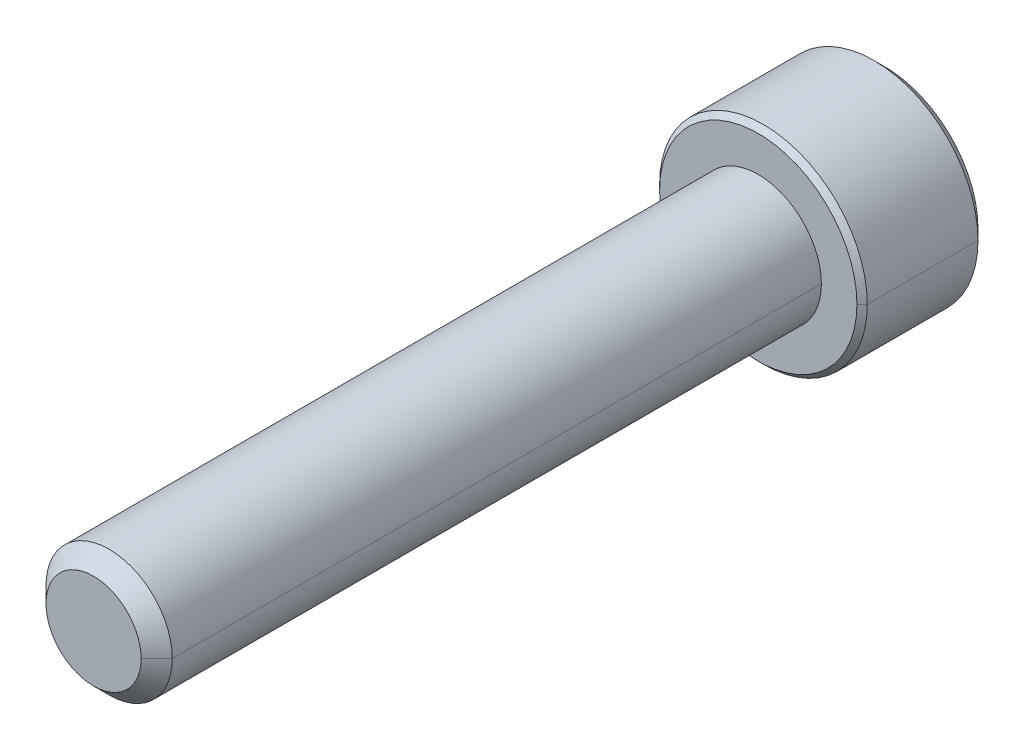
ISO-10303-21;
HEADER;
FILE_DESCRIPTION(('STEP AP214'),'2;1');
FILE_NAME('part.step','',(''),(''),'','','');
FILE_SCHEMA(('AUTOMOTIVE_DESIGN { 1 0 10303 214 1 1 1 1 }'));
ENDSEC;
DATA;
#1=APPLICATION_CONTEXT('core data for automotive mechanical design processes');
#2=APPLICATION_PROTOCOL_DEFINITION('international standard','automotive_design',2000,#1);
#3=PRODUCT_CONTEXT('',#1,'mechanical');
#4=PRODUCT('Part','Part','',(#3));
#5=PRODUCT_RELATED_PRODUCT_CATEGORY('part','',(#4));
#6=PRODUCT_DEFINITION_FORMATION('','',#4);
#7=PRODUCT_DEFINITION_CONTEXT('part definition',#1,'design');
#8=PRODUCT_DEFINITION('design','',#6,#7);
#9=PRODUCT_DEFINITION_SHAPE('','',#8);
#10=(LENGTH_UNIT() NAMED_UNIT(*) SI_UNIT(.MILLI.,.METRE.));
#11=(NAMED_UNIT(*) PLANE_ANGLE_UNIT() SI_UNIT($,.RADIAN.));
#12=(NAMED_UNIT(*) SI_UNIT($,.STERADIAN.) SOLID_ANGLE_UNIT());
#13=UNCERTAINTY_MEASURE_WITH_UNIT(LENGTH_MEASURE(1.E-05),#10,'distance_accuracy_value','');
#14=(GEOMETRIC_REPRESENTATION_CONTEXT(3) GLOBAL_UNCERTAINTY_ASSIGNED_CONTEXT((#13)) GLOBAL_UNIT_ASSIGNED_CONTEXT((#10,
#11,#12)) REPRESENTATION_CONTEXT('',''));
#15=CARTESIAN_POINT('',(0.,0.,0.));
#16=DIRECTION('',(0.,0.,1.));
#17=DIRECTION('',(1.,0.,0.));
#18=AXIS2_PLACEMENT_3D('',#15,#16,#17);
#19=CARTESIAN_POINT('',(0.,0.,-25.5984375));
#20=DIRECTION('',(0.,0.,-1.));
#21=DIRECTION('',(-1.,0.,0.));
#22=AXIS2_PLACEMENT_3D('',#19,#20,#21);
#23=CONICAL_SURFACE('',#22,3.96875,0.785398163397439);
#24=DIRECTION('',(0.707106781186541,0.,-0.707106781186554));
#25=VECTOR('',#24,1.);
#26=CARTESIAN_POINT('',(3.96875,0.,-25.5984375));
#27=LINE('',#26,#25);
#28=CARTESIAN_POINT('',(3.7703125,0.,-25.4));
#29=VERTEX_POINT('',#28);
#30=CARTESIAN_POINT('',(3.96875,0.,-25.5984375));
#31=VERTEX_POINT('',#30);
#32=EDGE_CURVE('E461',#29,#31,#27,.T.);
#33=ORIENTED_EDGE('',*,*,#32,.F.);
#34=CARTESIAN_POINT('',(0.,0.,-25.4));
#35=DIRECTION('',(0.,0.,1.));
#36=DIRECTION('',(-1.,0.,0.));
#37=AXIS2_PLACEMENT_3D('',#34,#35,#36);
#38=CIRCLE('',#37,3.7703125);
#39=CARTESIAN_POINT('',(-3.7703125,0.,-25.4));
#40=VERTEX_POINT('',#39);
#41=EDGE_CURVE('E379',#40,#29,#38,.T.);
#42=ORIENTED_EDGE('',*,*,#41,.F.);
#43=DIRECTION('',(-0.707106781186541,0.,-0.707106781186554));
#44=VECTOR('',#43,1.);
#45=CARTESIAN_POINT('',(-3.96875,0.,-25.5984375));
#46=LINE('',#45,#44);
#47=CARTESIAN_POINT('',(-3.96875,0.,-25.5984375));
#48=VERTEX_POINT('',#47);
#49=EDGE_CURVE('E395',#40,#48,#46,.T.);
#50=ORIENTED_EDGE('',*,*,#49,.T.);
#51=CARTESIAN_POINT('',(0.,0.,-25.5984375));
#52=DIRECTION('',(0.,0.,-1.));
#53=DIRECTION('',(-1.,0.,0.));
#54=AXIS2_PLACEMENT_3D('',#51,#52,#53);
#55=CIRCLE('',#54,3.96875);
#56=EDGE_CURVE('E427',#31,#48,#55,.T.);
#57=ORIENTED_EDGE('',*,*,#56,.F.);
#58=EDGE_LOOP('',(#33,#42,#50,#57));
#59=FACE_BOUND('',#58,.T.);
#60=ADVANCED_FACE('F16',(#59),#23,.T.);
#61=CARTESIAN_POINT('',(0.,0.,-30.226));
#62=DIRECTION('',(0.,0.,1.));
#63=DIRECTION('',(1.,0.,0.));
#64=AXIS2_PLACEMENT_3D('',#61,#62,#63);
#65=CONICAL_SURFACE('',#64,3.571875,0.785398163397443);
#66=DIRECTION('',(-0.707106781186545,0.,0.707106781186551));
#67=VECTOR('',#66,1.);
#68=CARTESIAN_POINT('',(-3.571875,0.,-30.226));
#69=LINE('',#68,#67);
#70=CARTESIAN_POINT('',(-3.571875,0.,-30.226));
#71=VERTEX_POINT('',#70);
#72=CARTESIAN_POINT('',(-3.96875,0.,-29.829125));
#73=VERTEX_POINT('',#72);
#74=EDGE_CURVE('E438',#71,#73,#69,.T.);
#75=ORIENTED_EDGE('',*,*,#74,.F.);
#76=CARTESIAN_POINT('',(0.,0.,-30.226));
#77=DIRECTION('',(0.,0.,-1.));
#78=DIRECTION('',(-1.,0.,0.));
#79=AXIS2_PLACEMENT_3D('',#76,#77,#78);
#80=CIRCLE('',#79,3.571875);
#81=CARTESIAN_POINT('',(3.571875,0.,-30.226));
#82=VERTEX_POINT('',#81);
#83=EDGE_CURVE('E425',#82,#71,#80,.T.);
#84=ORIENTED_EDGE('',*,*,#83,.F.);
#85=DIRECTION('',(0.707106781186545,0.,0.707106781186551));
#86=VECTOR('',#85,1.);
#87=CARTESIAN_POINT('',(3.571875,0.,-30.226));
#88=LINE('',#87,#86);
#89=CARTESIAN_POINT('',(3.96875,0.,-29.829125));
#90=VERTEX_POINT('',#89);
#91=EDGE_CURVE('E160',#82,#90,#88,.T.);
#92=ORIENTED_EDGE('',*,*,#91,.T.);
#93=CARTESIAN_POINT('',(0.,0.,-29.829125));
#94=DIRECTION('',(0.,0.,1.));
#95=DIRECTION('',(-1.,0.,0.));
#96=AXIS2_PLACEMENT_3D('',#93,#94,#95);
#97=CIRCLE('',#96,3.96875);
#98=EDGE_CURVE('E464',#73,#90,#97,.T.);
#99=ORIENTED_EDGE('',*,*,#98,.F.);
#100=EDGE_LOOP('',(#75,#84,#92,#99));
#101=FACE_BOUND('',#100,.T.);
#102=ADVANCED_FACE('F185',(#101),#65,.T.);
#103=CARTESIAN_POINT('',(-1.984375,1.14567944042316,-27.2494375));
#104=DIRECTION('',(-0.5,0.866025403784439,0.));
#105=DIRECTION('',(0.,0.,1.));
#106=AXIS2_PLACEMENT_3D('',#103,#104,#105);
#107=PLANE('',#106);
#108=DIRECTION('',(0.,0.,-1.));
#109=VECTOR('',#108,1.);
#110=CARTESIAN_POINT('',(-1.984375,1.14567944042316,-27.2494375));
#111=LINE('',#110,#109);
#112=CARTESIAN_POINT('',(-1.984375,1.14567944042316,-27.2494375));
#113=VERTEX_POINT('',#112);
#114=CARTESIAN_POINT('',(-1.984375,1.14567944042316,-30.226));
#115=VERTEX_POINT('',#114);
#116=EDGE_CURVE('E11',#113,#115,#111,.T.);
#117=ORIENTED_EDGE('',*,*,#116,.T.);
#118=CARTESIAN_POINT('',(-1.984375,1.14567944042316,-30.226));
#119=CARTESIAN_POINT('',(-1.73366939815845,1.29042438713373,-30.0812550532894));
#120=CARTESIAN_POINT('',(-1.50657958379882,1.42153475258449,-30.006003737124));
#121=CARTESIAN_POINT('',(-1.24618678362297,1.57187260586105,-29.9197167277815));
#122=CARTESIAN_POINT('',(-0.995841783844753,1.71640935887328,-29.9190206054613));
#123=CARTESIAN_POINT('',(-0.74595146867772,1.86068359960285,-29.9183257474609));
#124=CARTESIAN_POINT('',(-0.484436999445984,2.01166904881077,-30.0038176627032));
#125=CARTESIAN_POINT('',(-0.254810637070535,2.14424389094127,-30.0788850100942));
#126=CARTESIAN_POINT('',(0.,2.29135888084633,-30.226));
#127=B_SPLINE_CURVE_WITH_KNOTS('',2,(#118,#119,#120,#121,#122,#123,#124,#125,#126),
.UNSPECIFIED.,.F.,.F.,(3,2,2,2,3),(0.,0.25,0.5,0.75,1.),.UNSPECIFIED.);
#128=CARTESIAN_POINT('',(0.,2.29135888084632,-30.226));
#129=VERTEX_POINT('',#128);
#130=EDGE_CURVE('E156',#115,#129,#127,.T.);
#131=ORIENTED_EDGE('',*,*,#130,.T.);
#132=DIRECTION('',(0.,0.,-1.));
#133=VECTOR('',#132,1.);
#134=CARTESIAN_POINT('',(0.,2.29135888084632,-27.2494375));
#135=LINE('',#134,#133);
#136=CARTESIAN_POINT('',(0.,2.29135888084632,-27.2494375));
#137=VERTEX_POINT('',#136);
#138=EDGE_CURVE('E133',#137,#129,#135,.T.);
#139=ORIENTED_EDGE('',*,*,#138,.F.);
#140=DIRECTION('',(0.866025403784439,0.5,0.));
#141=VECTOR('',#140,1.);
#142=CARTESIAN_POINT('',(-1.984375,1.14567944042316,-27.2494375));
#143=LINE('',#142,#141);
#144=EDGE_CURVE('E148',#113,#137,#143,.T.);
#145=ORIENTED_EDGE('',*,*,#144,.F.);
#146=EDGE_LOOP('',(#117,#131,#139,#145));
#147=FACE_BOUND('',#146,.T.);
#148=ADVANCED_FACE('F175',(#147),#107,.F.);
#149=CARTESIAN_POINT('',(-1.984375,-1.14567944042316,-27.2494375));
#150=DIRECTION('',(-1.,0.,0.));
#151=DIRECTION('',(0.,0.,1.));
#152=AXIS2_PLACEMENT_3D('',#149,#150,#151);
#153=PLANE('',#152);
#154=DIRECTION('',(0.,0.,-1.));
#155=VECTOR('',#154,1.);
#156=CARTESIAN_POINT('',(-1.984375,-1.14567944042316,-27.2494375));
#157=LINE('',#156,#155);
#158=CARTESIAN_POINT('',(-1.984375,-1.14567944042316,-27.2494375));
#159=VERTEX_POINT('',#158);
#160=CARTESIAN_POINT('',(-1.984375,-1.14567944042316,-30.226));
#161=VERTEX_POINT('',#160);
#162=EDGE_CURVE('E30',#159,#161,#157,.T.);
#163=ORIENTED_EDGE('',*,*,#162,.T.);
#164=CARTESIAN_POINT('',(-1.984375,-1.14567944042316,-30.226));
#165=CARTESIAN_POINT('',(-1.984375,-0.853952770830586,-30.0801366652037));
#166=CARTESIAN_POINT('',(-1.984375,-0.589840907955465,-30.0048238254197));
#167=CARTESIAN_POINT('',(-1.984375,-0.288924978932779,-29.9190161191537));
#168=CARTESIAN_POINT('',(-1.984375,0.,-29.9190161191537));
#169=B_SPLINE_CURVE_WITH_KNOTS('',2,(#164,#165,#166,#167,#168),.UNSPECIFIED.,.F.,.F.,(3,2,3),
(0.,0.5,1.),.UNSPECIFIED.);
#170=CARTESIAN_POINT('',(-1.984375,0.,-29.9190161191537));
#171=VERTEX_POINT('',#170);
#172=EDGE_CURVE('E363',#161,#171,#169,.T.);
#173=ORIENTED_EDGE('',*,*,#172,.T.);
#174=CARTESIAN_POINT('',(-1.984375,0.,-29.9190161191537));
#175=CARTESIAN_POINT('',(-1.984375,0.288490660783442,-29.9190161191537));
#176=CARTESIAN_POINT('',(-1.984375,0.589967873643751,-30.0048600043339));
#177=CARTESIAN_POINT('',(-1.984375,0.853448743562751,-30.0798846515698));
#178=CARTESIAN_POINT('',(-1.984375,1.14567944042317,-30.226));
#179=B_SPLINE_CURVE_WITH_KNOTS('',2,(#174,#175,#176,#177,#178),.UNSPECIFIED.,.F.,.F.,(3,2,3),
(0.,0.5,1.),.UNSPECIFIED.);
#180=EDGE_CURVE('E245',#171,#115,#179,.T.);
#181=ORIENTED_EDGE('',*,*,#180,.T.);
#182=ORIENTED_EDGE('',*,*,#116,.F.);
#183=DIRECTION('',(0.,1.,0.));
#184=VECTOR('',#183,1.);
#185=CARTESIAN_POINT('',(-1.984375,-1.14567944042316,-27.2494375));
#186=LINE('',#185,#184);
#187=EDGE_CURVE('E166',#159,#113,#186,.T.);
#188=ORIENTED_EDGE('',*,*,#187,.F.);
#189=EDGE_LOOP('',(#163,#173,#181,#182,#188));
#190=FACE_BOUND('',#189,.T.);
#191=ADVANCED_FACE('F184',(#190),#153,.F.);
#192=CARTESIAN_POINT('',(0.,-2.29135888084632,-27.2494375));
#193=DIRECTION('',(-0.5,-0.866025403784439,0.));
#194=DIRECTION('',(-0.866025403784439,0.5,0.));
#195=AXIS2_PLACEMENT_3D('',#192,#193,#194);
#196=PLANE('',#195);
#197=DIRECTION('',(0.,0.,-1.));
#198=VECTOR('',#197,1.);
#199=CARTESIAN_POINT('',(0.,-2.29135888084632,-27.2494375));
#200=LINE('',#199,#198);
#201=CARTESIAN_POINT('',(0.,-2.29135888084632,-27.2494375));
#202=VERTEX_POINT('',#201);
#203=CARTESIAN_POINT('',(0.,-2.29135888084632,-30.226));
#204=VERTEX_POINT('',#203);
#205=EDGE_CURVE('E224',#202,#204,#200,.T.);
#206=ORIENTED_EDGE('',*,*,#205,.T.);
#207=CARTESIAN_POINT('',(0.,-2.29135888084632,-30.226));
#208=CARTESIAN_POINT('',(-0.250705601837906,-2.14661393413786,-30.0812550532915));
#209=CARTESIAN_POINT('',(-0.477795416201182,-2.015503568685,-30.006003737124));
#210=CARTESIAN_POINT('',(-0.738188216371028,-1.8651657154119,-29.9197167277824));
#211=CARTESIAN_POINT('',(-0.988533216155246,-1.72062896239621,-29.9190206054613));
#212=CARTESIAN_POINT('',(-1.23842353132543,-1.57635472166482,-29.9183257474599));
#213=CARTESIAN_POINT('',(-1.49993800055402,-1.42536927245872,-30.0038176627032));
#214=CARTESIAN_POINT('',(-1.7295643629364,-1.29279443032421,-30.0788850100982));
#215=CARTESIAN_POINT('',(-1.984375,-1.14567944042316,-30.226));
#216=B_SPLINE_CURVE_WITH_KNOTS('',2,(#207,#208,#209,#210,#211,#212,#213,#214,#215),
.UNSPECIFIED.,.F.,.F.,(3,2,2,2,3),(0.,0.25,0.5,0.75,1.),.UNSPECIFIED.);
#217=EDGE_CURVE('E250',#204,#161,#216,.T.);
#218=ORIENTED_EDGE('',*,*,#217,.T.);
#219=ORIENTED_EDGE('',*,*,#162,.F.);
#220=DIRECTION('',(-0.866025403784439,0.5,0.));
#221=VECTOR('',#220,1.);
#222=CARTESIAN_POINT('',(0.,-2.29135888084632,-27.2494375));
#223=LINE('',#222,#221);
#224=EDGE_CURVE('E162',#202,#159,#223,.T.);
#225=ORIENTED_EDGE('',*,*,#224,.F.);
#226=EDGE_LOOP('',(#206,#218,#219,#225));
#227=FACE_BOUND('',#226,.T.);
#228=ADVANCED_FACE('F256',(#227),#196,.F.);
#229=CARTESIAN_POINT('',(1.984375,-1.14567944042316,-27.2494375));
#230=DIRECTION('',(0.5,-0.866025403784439,0.));
#231=DIRECTION('',(0.,0.,-1.));
#232=AXIS2_PLACEMENT_3D('',#229,#230,#231);
#233=PLANE('',#232);
#234=DIRECTION('',(0.,0.,-1.));
#235=VECTOR('',#234,1.);
#236=CARTESIAN_POINT('',(1.984375,-1.14567944042316,-27.2494375));
#237=LINE('',#236,#235);
#238=CARTESIAN_POINT('',(1.984375,-1.14567944042316,-27.2494375));
#239=VERTEX_POINT('',#238);
#240=CARTESIAN_POINT('',(1.984375,-1.14567944042316,-30.226));
#241=VERTEX_POINT('',#240);
#242=EDGE_CURVE('E132',#239,#241,#237,.T.);
#243=ORIENTED_EDGE('',*,*,#242,.T.);
#244=CARTESIAN_POINT('',(1.984375,-1.14567944042316,-30.226));
#245=CARTESIAN_POINT('',(1.73366939816214,-1.2904243871316,-30.0812550532916));
#246=CARTESIAN_POINT('',(1.50657958379882,-1.42153475258449,-30.006003737124));
#247=CARTESIAN_POINT('',(1.24618678362332,-1.57187260586085,-29.9197167277806));
#248=CARTESIAN_POINT('',(0.995841783844752,-1.71640935887328,-29.9190206054613));
#249=CARTESIAN_POINT('',(0.745951468668843,-1.86068359960797,-29.9183257474618));
#250=CARTESIAN_POINT('',(0.484436999445984,-2.01166904881077,-30.0038176627032));
#251=CARTESIAN_POINT('',(0.254810637063568,-2.1442438909453,-30.0788850100983));
#252=CARTESIAN_POINT('',(0.,-2.29135888084633,-30.226));
#253=B_SPLINE_CURVE_WITH_KNOTS('',2,(#244,#245,#246,#247,#248,#249,#250,#251,#252),
.UNSPECIFIED.,.F.,.F.,(3,2,2,2,3),(0.,0.25,0.5,0.75,1.),.UNSPECIFIED.);
#254=EDGE_CURVE('E340',#241,#204,#253,.T.);
#255=ORIENTED_EDGE('',*,*,#254,.T.);
#256=ORIENTED_EDGE('',*,*,#205,.F.);
#257=DIRECTION('',(-0.866025403784439,-0.5,0.));
#258=VECTOR('',#257,1.);
#259=CARTESIAN_POINT('',(1.984375,-1.14567944042316,-27.2494375));
#260=LINE('',#259,#258);
#261=EDGE_CURVE('E143',#239,#202,#260,.T.);
#262=ORIENTED_EDGE('',*,*,#261,.F.);
#263=EDGE_LOOP('',(#243,#255,#256,#262));
#264=FACE_BOUND('',#263,.T.);
#265=ADVANCED_FACE('F266',(#264),#233,.F.);
#266=CARTESIAN_POINT('',(1.984375,1.14567944042316,-27.2494375));
#267=DIRECTION('',(1.,0.,0.));
#268=DIRECTION('',(0.,1.,0.));
#269=AXIS2_PLACEMENT_3D('',#266,#267,#268);
#270=PLANE('',#269);
#271=DIRECTION('',(0.,0.,-1.));
#272=VECTOR('',#271,1.);
#273=CARTESIAN_POINT('',(1.984375,1.14567944042316,-27.2494375));
#274=LINE('',#273,#272);
#275=CARTESIAN_POINT('',(1.984375,1.14567944042316,-27.2494375));
#276=VERTEX_POINT('',#275);
#277=CARTESIAN_POINT('',(1.984375,1.14567944042316,-30.226));
#278=VERTEX_POINT('',#277);
#279=EDGE_CURVE('E117',#276,#278,#274,.T.);
#280=ORIENTED_EDGE('',*,*,#279,.T.);
#281=CARTESIAN_POINT('',(1.984375,1.14567944042316,-30.226));
#282=CARTESIAN_POINT('',(1.984375,0.854053734702035,-30.0801871471394));
#283=CARTESIAN_POINT('',(1.984375,0.590027301204523,-30.0048769406947));
#284=CARTESIAN_POINT('',(1.984375,0.289359062323233,-29.9191151219193));
#285=CARTESIAN_POINT('',(1.984375,0.000124911500085914,-29.9190161230851));
#286=CARTESIAN_POINT('',(1.984375,-0.288056722159542,-29.9189174845056));
#287=CARTESIAN_POINT('',(1.984375,-0.589781630516821,-30.0048069367442));
#288=CARTESIAN_POINT('',(1.984375,-0.853347275069476,-30.0798339173232));
#289=CARTESIAN_POINT('',(1.984375,-1.14567944042316,-30.226));
#290=B_SPLINE_CURVE_WITH_KNOTS('',2,(#281,#282,#283,#284,#285,#286,#287,#288,#289),
.UNSPECIFIED.,.F.,.F.,(3,2,2,2,3),(0.,0.25,0.5,0.75,1.),.UNSPECIFIED.);
#291=EDGE_CURVE('E309',#278,#241,#290,.T.);
#292=ORIENTED_EDGE('',*,*,#291,.T.);
#293=ORIENTED_EDGE('',*,*,#242,.F.);
#294=DIRECTION('',(0.,-1.,0.));
#295=VECTOR('',#294,1.);
#296=CARTESIAN_POINT('',(1.984375,1.14567944042316,-27.2494375));
#297=LINE('',#296,#295);
#298=EDGE_CURVE('E136',#276,#239,#297,.T.);
#299=ORIENTED_EDGE('',*,*,#298,.F.);
#300=EDGE_LOOP('',(#280,#292,#293,#299));
#301=FACE_BOUND('',#300,.T.);
#302=ADVANCED_FACE('F137',(#301),#270,.F.);
#303=CARTESIAN_POINT('',(0.,2.29135888084632,-27.2494375));
#304=DIRECTION('',(0.5,0.866025403784439,0.));
#305=DIRECTION('',(0.,0.,-1.));
#306=AXIS2_PLACEMENT_3D('',#303,#304,#305);
#307=PLANE('',#306);
#308=ORIENTED_EDGE('',*,*,#138,.T.);
#309=CARTESIAN_POINT('',(0.,2.29135888084632,-30.226));
#310=CARTESIAN_POINT('',(0.250705601841665,2.14661393413569,-30.0812550532894));
#311=CARTESIAN_POINT('',(0.477795416201182,2.015503568685,-30.006003737124));
#312=CARTESIAN_POINT('',(0.738188216377096,1.8651657154084,-29.9197167277815));
#313=CARTESIAN_POINT('',(0.988533216155247,1.72062896239621,-29.9190206054614));
#314=CARTESIAN_POINT('',(1.23842353132225,1.57635472166666,-29.9183257474609));
#315=CARTESIAN_POINT('',(1.49993800055402,1.42536927245872,-30.0038176627032));
#316=CARTESIAN_POINT('',(1.7295643629294,1.29279443032825,-30.0788850100942));
#317=CARTESIAN_POINT('',(1.984375,1.14567944042316,-30.226));
#318=B_SPLINE_CURVE_WITH_KNOTS('',2,(#309,#310,#311,#312,#313,#314,#315,#316,#317),
.UNSPECIFIED.,.F.,.F.,(3,2,2,2,3),(0.,0.25,0.5,0.75,1.),.UNSPECIFIED.);
#319=EDGE_CURVE('E125',#129,#278,#318,.T.);
#320=ORIENTED_EDGE('',*,*,#319,.T.);
#321=ORIENTED_EDGE('',*,*,#279,.F.);
#322=DIRECTION('',(0.866025403784439,-0.5,0.));
#323=VECTOR('',#322,1.);
#324=CARTESIAN_POINT('',(0.,2.29135888084632,-27.2494375));
#325=LINE('',#324,#323);
#326=EDGE_CURVE('E121',#137,#276,#325,.T.);
#327=ORIENTED_EDGE('',*,*,#326,.F.);
#328=EDGE_LOOP('',(#308,#320,#321,#327));
#329=FACE_BOUND('',#328,.T.);
#330=ADVANCED_FACE('F119',(#329),#307,.F.);
#331=CARTESIAN_POINT('',(1.984375,3.43703832126949,-27.2494375));
#332=DIRECTION('',(0.,0.,-1.));
#333=DIRECTION('',(0.,-1.,0.));
#334=AXIS2_PLACEMENT_3D('',#331,#332,#333);
#335=PLANE('',#334);
#336=ORIENTED_EDGE('',*,*,#144,.T.);
#337=ORIENTED_EDGE('',*,*,#326,.T.);
#338=ORIENTED_EDGE('',*,*,#298,.T.);
#339=ORIENTED_EDGE('',*,*,#261,.T.);
#340=ORIENTED_EDGE('',*,*,#224,.T.);
#341=ORIENTED_EDGE('',*,*,#187,.T.);
#342=EDGE_LOOP('',(#336,#337,#338,#339,#340,#341));
#343=FACE_BOUND('',#342,.T.);
#344=ADVANCED_FACE('F145',(#343),#335,.T.);
#345=CARTESIAN_POINT('',(0.,0.,-30.226));
#346=DIRECTION('',(0.,0.,-1.));
#347=DIRECTION('',(-1.,0.,0.));
#348=AXIS2_PLACEMENT_3D('',#345,#346,#347);
#349=CONICAL_SURFACE('',#348,2.29135888084632,0.78539816339745);
#350=CARTESIAN_POINT('',(0.,0.,-30.226));
#351=DIRECTION('',(0.,0.,-1.));
#352=DIRECTION('',(-1.,0.,0.));
#353=AXIS2_PLACEMENT_3D('',#350,#351,#352);
#354=CIRCLE('',#353,2.29135888084632);
#355=EDGE_CURVE('E237',#115,#129,#354,.T.);
#356=ORIENTED_EDGE('',*,*,#355,.T.);
#357=ORIENTED_EDGE('',*,*,#130,.F.);
#358=EDGE_LOOP('',(#356,#357));
#359=FACE_BOUND('',#358,.T.);
#360=ADVANCED_FACE('F206',(#359),#349,.F.);
#361=CARTESIAN_POINT('',(0.,0.,-30.226));
#362=DIRECTION('',(0.,0.,-1.));
#363=DIRECTION('',(-1.,0.,0.));
#364=AXIS2_PLACEMENT_3D('',#361,#362,#363);
#365=CONICAL_SURFACE('',#364,2.29135888084632,0.78539816339745);
#366=DIRECTION('',(-0.707106781186549,0.,-0.707106781186546));
#367=VECTOR('',#366,1.);
#368=CARTESIAN_POINT('',(-2.29135888084632,0.,-30.226));
#369=LINE('',#368,#367);
#370=CARTESIAN_POINT('',(-2.29135888084632,0.,-30.226));
#371=VERTEX_POINT('',#370);
#372=EDGE_CURVE('E240',#171,#371,#369,.T.);
#373=ORIENTED_EDGE('',*,*,#372,.F.);
#374=ORIENTED_EDGE('',*,*,#172,.F.);
#375=CARTESIAN_POINT('',(0.,0.,-30.226));
#376=DIRECTION('',(0.,0.,-1.));
#377=DIRECTION('',(-1.,0.,0.));
#378=AXIS2_PLACEMENT_3D('',#375,#376,#377);
#379=CIRCLE('',#378,2.29135888084632);
#380=EDGE_CURVE('E232',#161,#371,#379,.T.);
#381=ORIENTED_EDGE('',*,*,#380,.T.);
#382=EDGE_LOOP('',(#373,#374,#381));
#383=FACE_BOUND('',#382,.T.);
#384=ADVANCED_FACE('F201',(#383),#365,.F.);
#385=CARTESIAN_POINT('',(0.,0.,-30.226));
#386=DIRECTION('',(0.,0.,-1.));
#387=DIRECTION('',(-1.,0.,0.));
#388=AXIS2_PLACEMENT_3D('',#385,#386,#387);
#389=CONICAL_SURFACE('',#388,2.29135888084632,0.78539816339745);
#390=CARTESIAN_POINT('',(0.,0.,-30.226));
#391=DIRECTION('',(0.,0.,-1.));
#392=DIRECTION('',(-1.,0.,0.));
#393=AXIS2_PLACEMENT_3D('',#390,#391,#392);
#394=CIRCLE('',#393,2.29135888084632);
#395=EDGE_CURVE('E227',#204,#161,#394,.T.);
#396=ORIENTED_EDGE('',*,*,#395,.T.);
#397=ORIENTED_EDGE('',*,*,#217,.F.);
#398=EDGE_LOOP('',(#396,#397));
#399=FACE_BOUND('',#398,.T.);
#400=ADVANCED_FACE('F205',(#399),#389,.F.);
#401=CARTESIAN_POINT('',(0.,0.,-30.226));
#402=DIRECTION('',(0.,0.,-1.));
#403=DIRECTION('',(-1.,0.,0.));
#404=AXIS2_PLACEMENT_3D('',#401,#402,#403);
#405=CONICAL_SURFACE('',#404,2.29135888084632,0.78539816339745);
#406=CARTESIAN_POINT('',(0.,0.,-30.226));
#407=DIRECTION('',(0.,0.,-1.));
#408=DIRECTION('',(-1.,0.,0.));
#409=AXIS2_PLACEMENT_3D('',#406,#407,#408);
#410=CIRCLE('',#409,2.29135888084632);
#411=EDGE_CURVE('E231',#241,#204,#410,.T.);
#412=ORIENTED_EDGE('',*,*,#411,.T.);
#413=ORIENTED_EDGE('',*,*,#254,.F.);
#414=EDGE_LOOP('',(#412,#413));
#415=FACE_BOUND('',#414,.T.);
#416=ADVANCED_FACE('F281',(#415),#405,.F.);
#417=CARTESIAN_POINT('',(0.,0.,-30.226));
#418=DIRECTION('',(0.,0.,-1.));
#419=DIRECTION('',(-1.,0.,0.));
#420=AXIS2_PLACEMENT_3D('',#417,#418,#419);
#421=CONICAL_SURFACE('',#420,2.29135888084632,0.78539816339745);
#422=CARTESIAN_POINT('',(0.,0.,-30.226));
#423=DIRECTION('',(0.,0.,-1.));
#424=DIRECTION('',(-1.,0.,0.));
#425=AXIS2_PLACEMENT_3D('',#422,#423,#424);
#426=CIRCLE('',#425,2.29135888084632);
#427=EDGE_CURVE('E302',#278,#241,#426,.T.);
#428=ORIENTED_EDGE('',*,*,#427,.T.);
#429=ORIENTED_EDGE('',*,*,#291,.F.);
#430=EDGE_LOOP('',(#428,#429));
#431=FACE_BOUND('',#430,.T.);
#432=ADVANCED_FACE('F18',(#431),#421,.F.);
#433=CARTESIAN_POINT('',(0.,0.,-30.226));
#434=DIRECTION('',(0.,0.,-1.));
#435=DIRECTION('',(-1.,0.,0.));
#436=AXIS2_PLACEMENT_3D('',#433,#434,#435);
#437=CONICAL_SURFACE('',#436,2.29135888084632,0.78539816339745);
#438=CARTESIAN_POINT('',(0.,0.,-30.226));
#439=DIRECTION('',(0.,0.,-1.));
#440=DIRECTION('',(-1.,0.,0.));
#441=AXIS2_PLACEMENT_3D('',#438,#439,#440);
#442=CIRCLE('',#441,2.29135888084632);
#443=EDGE_CURVE('E305',#129,#278,#442,.T.);
#444=ORIENTED_EDGE('',*,*,#443,.T.);
#445=ORIENTED_EDGE('',*,*,#319,.F.);
#446=EDGE_LOOP('',(#444,#445));
#447=FACE_BOUND('',#446,.T.);
#448=ADVANCED_FACE('F635',(#447),#437,.F.);
#449=CARTESIAN_POINT('',(0.,0.,-25.4));
#450=DIRECTION('',(0.,0.,-1.));
#451=DIRECTION('',(0.,-1.,0.));
#452=AXIS2_PLACEMENT_3D('',#449,#450,#451);
#453=PLANE('',#452);
#454=CARTESIAN_POINT('',(0.,0.,-25.4));
#455=DIRECTION('',(0.,0.,1.));
#456=DIRECTION('',(-1.,0.,0.));
#457=AXIS2_PLACEMENT_3D('',#454,#455,#456);
#458=CIRCLE('',#457,2.413);
#459=CARTESIAN_POINT('',(2.413,0.,-25.4));
#460=VERTEX_POINT('',#459);
#461=CARTESIAN_POINT('',(-2.413,0.,-25.4));
#462=VERTEX_POINT('',#461);
#463=EDGE_CURVE('E412',#460,#462,#458,.T.);
#464=ORIENTED_EDGE('',*,*,#463,.F.);
#465=CARTESIAN_POINT('',(0.,0.,-25.4));
#466=DIRECTION('',(0.,0.,1.));
#467=DIRECTION('',(-1.,0.,0.));
#468=AXIS2_PLACEMENT_3D('',#465,#466,#467);
#469=CIRCLE('',#468,2.413);
#470=EDGE_CURVE('E401',#462,#460,#469,.T.);
#471=ORIENTED_EDGE('',*,*,#470,.F.);
#472=EDGE_LOOP('',(#464,#471));
#473=FACE_BOUND('',#472,.T.);
#474=ORIENTED_EDGE('',*,*,#41,.T.);
#475=CARTESIAN_POINT('',(0.,0.,-25.4));
#476=DIRECTION('',(0.,0.,1.));
#477=DIRECTION('',(-1.,0.,0.));
#478=AXIS2_PLACEMENT_3D('',#475,#476,#477);
#479=CIRCLE('',#478,3.7703125);
#480=EDGE_CURVE('E1012',#29,#40,#479,.T.);
#481=ORIENTED_EDGE('',*,*,#480,.T.);
#482=EDGE_LOOP('',(#474,#481));
#483=FACE_BOUND('',#482,.T.);
#484=ADVANCED_FACE('F610',(#473,#483),#453,.F.);
#485=CARTESIAN_POINT('',(0.,0.,-30.226));
#486=DIRECTION('',(0.,0.,-1.));
#487=DIRECTION('',(0.,-1.,0.));
#488=AXIS2_PLACEMENT_3D('',#485,#486,#487);
#489=PLANE('',#488);
#490=ORIENTED_EDGE('',*,*,#355,.F.);
#491=CARTESIAN_POINT('',(0.,0.,-30.226));
#492=DIRECTION('',(0.,0.,-1.));
#493=DIRECTION('',(-1.,0.,0.));
#494=AXIS2_PLACEMENT_3D('',#491,#492,#493);
#495=CIRCLE('',#494,2.29135888084632);
#496=EDGE_CURVE('E244',#371,#115,#495,.T.);
#497=ORIENTED_EDGE('',*,*,#496,.F.);
#498=ORIENTED_EDGE('',*,*,#380,.F.);
#499=ORIENTED_EDGE('',*,*,#395,.F.);
#500=ORIENTED_EDGE('',*,*,#411,.F.);
#501=ORIENTED_EDGE('',*,*,#427,.F.);
#502=ORIENTED_EDGE('',*,*,#443,.F.);
#503=EDGE_LOOP('',(#490,#497,#498,#499,#500,#501,#502));
#504=FACE_BOUND('',#503,.T.);
#505=ORIENTED_EDGE('',*,*,#83,.T.);
#506=CARTESIAN_POINT('',(0.,0.,-30.226));
#507=DIRECTION('',(0.,0.,-1.));
#508=DIRECTION('',(-1.,0.,0.));
#509=AXIS2_PLACEMENT_3D('',#506,#507,#508);
#510=CIRCLE('',#509,3.571875);
#511=EDGE_CURVE('E399',#71,#82,#510,.T.);
#512=ORIENTED_EDGE('',*,*,#511,.T.);
#513=EDGE_LOOP('',(#505,#512));
#514=FACE_BOUND('',#513,.T.);
#515=ADVANCED_FACE('F196',(#504,#514),#489,.T.);
#516=CARTESIAN_POINT('',(0.,0.,-30.226));
#517=DIRECTION('',(0.,0.,1.));
#518=DIRECTION('',(1.,0.,0.));
#519=AXIS2_PLACEMENT_3D('',#516,#517,#518);
#520=CYLINDRICAL_SURFACE('',#519,3.96875);
#521=DIRECTION('',(0.,0.,1.));
#522=VECTOR('',#521,1.);
#523=CARTESIAN_POINT('',(-3.96875,0.,-30.226));
#524=LINE('',#523,#522);
#525=EDGE_CURVE('E418',#73,#48,#524,.T.);
#526=ORIENTED_EDGE('',*,*,#525,.F.);
#527=ORIENTED_EDGE('',*,*,#98,.T.);
#528=DIRECTION('',(0.,0.,1.));
#529=VECTOR('',#528,1.);
#530=CARTESIAN_POINT('',(3.96875,0.,-30.226));
#531=LINE('',#530,#529);
#532=EDGE_CURVE('E414',#90,#31,#531,.T.);
#533=ORIENTED_EDGE('',*,*,#532,.T.);
#534=ORIENTED_EDGE('',*,*,#56,.T.);
#535=EDGE_LOOP('',(#526,#527,#533,#534));
#536=FACE_BOUND('',#535,.T.);
#537=ADVANCED_FACE('F192',(#536),#520,.T.);
#538=CARTESIAN_POINT('',(0.,0.,0.));
#539=DIRECTION('',(0.,0.,-1.));
#540=DIRECTION('',(-1.,0.,0.));
#541=AXIS2_PLACEMENT_3D('',#538,#539,#540);
#542=CONICAL_SURFACE('',#541,1.8176875,0.785398163397446);
#543=DIRECTION('',(0.707106781186546,0.,-0.707106781186549));
#544=VECTOR('',#543,1.);
#545=CARTESIAN_POINT('',(1.8176875,0.,0.));
#546=LINE('',#545,#544);
#547=CARTESIAN_POINT('',(1.8176875,0.,0.));
#548=VERTEX_POINT('',#547);
#549=CARTESIAN_POINT('',(2.413,0.,-0.5953125));
#550=VERTEX_POINT('',#549);
#551=EDGE_CURVE('E419',#548,#550,#546,.T.);
#552=ORIENTED_EDGE('',*,*,#551,.F.);
#553=CARTESIAN_POINT('',(0.,0.,0.));
#554=DIRECTION('',(0.,0.,1.));
#555=DIRECTION('',(1.,0.,0.));
#556=AXIS2_PLACEMENT_3D('',#553,#554,#555);
#557=CIRCLE('',#556,1.8176875);
#558=CARTESIAN_POINT('',(-1.8176875,0.,0.));
#559=VERTEX_POINT('',#558);
#560=EDGE_CURVE('E462',#559,#548,#557,.T.);
#561=ORIENTED_EDGE('',*,*,#560,.F.);
#562=DIRECTION('',(-0.707106781186546,0.,-0.707106781186549));
#563=VECTOR('',#562,1.);
#564=CARTESIAN_POINT('',(-1.8176875,0.,0.));
#565=LINE('',#564,#563);
#566=CARTESIAN_POINT('',(-2.413,0.,-0.5953125));
#567=VERTEX_POINT('',#566);
#568=EDGE_CURVE('E408',#559,#567,#565,.T.);
#569=ORIENTED_EDGE('',*,*,#568,.T.);
#570=CARTESIAN_POINT('',(0.,0.,-0.5953125));
#571=DIRECTION('',(0.,0.,-1.));
#572=DIRECTION('',(1.,0.,0.));
#573=AXIS2_PLACEMENT_3D('',#570,#571,#572);
#574=CIRCLE('',#573,2.413);
#575=EDGE_CURVE('E404',#550,#567,#574,.T.);
#576=ORIENTED_EDGE('',*,*,#575,.F.);
#577=EDGE_LOOP('',(#552,#561,#569,#576));
#578=FACE_BOUND('',#577,.T.);
#579=ADVANCED_FACE('F195',(#578),#542,.T.);
#580=CARTESIAN_POINT('',(0.,0.,0.));
#581=DIRECTION('',(0.,0.,1.));
#582=DIRECTION('',(1.,0.,0.));
#583=AXIS2_PLACEMENT_3D('',#580,#581,#582);
#584=PLANE('',#583);
#585=ORIENTED_EDGE('',*,*,#560,.T.);
#586=CARTESIAN_POINT('',(0.,0.,0.));
#587=DIRECTION('',(0.,0.,1.));
#588=DIRECTION('',(1.,0.,0.));
#589=AXIS2_PLACEMENT_3D('',#586,#587,#588);
#590=CIRCLE('',#589,1.8176875);
#591=EDGE_CURVE('E417',#548,#559,#590,.T.);
#592=ORIENTED_EDGE('',*,*,#591,.T.);
#593=EDGE_LOOP('',(#585,#592));
#594=FACE_BOUND('',#593,.T.);
#595=ADVANCED_FACE('F190',(#594),#584,.T.);
#596=CARTESIAN_POINT('',(0.,0.,-25.4));
#597=DIRECTION('',(0.,0.,1.));
#598=DIRECTION('',(1.,0.,0.));
#599=AXIS2_PLACEMENT_3D('',#596,#597,#598);
#600=CYLINDRICAL_SURFACE('',#599,2.413);
#601=DIRECTION('',(0.,0.,1.));
#602=VECTOR('',#601,1.);
#603=CARTESIAN_POINT('',(-2.413,0.,-25.4));
#604=LINE('',#603,#602);
#605=EDGE_CURVE('E432',#462,#567,#604,.T.);
#606=ORIENTED_EDGE('',*,*,#605,.F.);
#607=ORIENTED_EDGE('',*,*,#470,.T.);
#608=DIRECTION('',(0.,0.,1.));
#609=VECTOR('',#608,1.);
#610=CARTESIAN_POINT('',(2.413,0.,-25.4));
#611=LINE('',#610,#609);
#612=EDGE_CURVE('E405',#460,#550,#611,.T.);
#613=ORIENTED_EDGE('',*,*,#612,.T.);
#614=ORIENTED_EDGE('',*,*,#575,.T.);
#615=EDGE_LOOP('',(#606,#607,#613,#614));
#616=FACE_BOUND('',#615,.T.);
#617=ADVANCED_FACE('F186',(#616),#600,.T.);
#618=CARTESIAN_POINT('',(0.,0.,-25.4));
#619=DIRECTION('',(0.,0.,1.));
#620=DIRECTION('',(1.,0.,0.));
#621=AXIS2_PLACEMENT_3D('',#618,#619,#620);
#622=CYLINDRICAL_SURFACE('',#621,2.413);
#623=ORIENTED_EDGE('',*,*,#463,.T.);
#624=ORIENTED_EDGE('',*,*,#605,.T.);
#625=CARTESIAN_POINT('',(0.,0.,-0.5953125));
#626=DIRECTION('',(0.,0.,-1.));
#627=DIRECTION('',(1.,0.,0.));
#628=AXIS2_PLACEMENT_3D('',#625,#626,#627);
#629=CIRCLE('',#628,2.413);
#630=EDGE_CURVE('E413',#567,#550,#629,.T.);
#631=ORIENTED_EDGE('',*,*,#630,.T.);
#632=ORIENTED_EDGE('',*,*,#612,.F.);
#633=EDGE_LOOP('',(#623,#624,#631,#632));
#634=FACE_BOUND('',#633,.T.);
#635=ADVANCED_FACE('F189',(#634),#622,.T.);
#636=CARTESIAN_POINT('',(0.,0.,0.));
#637=DIRECTION('',(0.,0.,-1.));
#638=DIRECTION('',(-1.,0.,0.));
#639=AXIS2_PLACEMENT_3D('',#636,#637,#638);
#640=CONICAL_SURFACE('',#639,1.8176875,0.785398163397446);
#641=ORIENTED_EDGE('',*,*,#591,.F.);
#642=ORIENTED_EDGE('',*,*,#551,.T.);
#643=ORIENTED_EDGE('',*,*,#630,.F.);
#644=ORIENTED_EDGE('',*,*,#568,.F.);
#645=EDGE_LOOP('',(#641,#642,#643,#644));
#646=FACE_BOUND('',#645,.T.);
#647=ADVANCED_FACE('F271',(#646),#640,.T.);
#648=CARTESIAN_POINT('',(0.,0.,-30.226));
#649=DIRECTION('',(0.,0.,1.));
#650=DIRECTION('',(1.,0.,0.));
#651=AXIS2_PLACEMENT_3D('',#648,#649,#650);
#652=CYLINDRICAL_SURFACE('',#651,3.96875);
#653=CARTESIAN_POINT('',(0.,0.,-29.829125));
#654=DIRECTION('',(0.,0.,1.));
#655=DIRECTION('',(-1.,0.,0.));
#656=AXIS2_PLACEMENT_3D('',#653,#654,#655);
#657=CIRCLE('',#656,3.96875);
#658=EDGE_CURVE('E435',#90,#73,#657,.T.);
#659=ORIENTED_EDGE('',*,*,#658,.T.);
#660=ORIENTED_EDGE('',*,*,#525,.T.);
#661=CARTESIAN_POINT('',(0.,0.,-25.5984375));
#662=DIRECTION('',(0.,0.,-1.));
#663=DIRECTION('',(-1.,0.,0.));
#664=AXIS2_PLACEMENT_3D('',#661,#662,#663);
#665=CIRCLE('',#664,3.96875);
#666=EDGE_CURVE('E400',#48,#31,#665,.T.);
#667=ORIENTED_EDGE('',*,*,#666,.T.);
#668=ORIENTED_EDGE('',*,*,#532,.F.);
#669=EDGE_LOOP('',(#659,#660,#667,#668));
#670=FACE_BOUND('',#669,.T.);
#671=ADVANCED_FACE('F274',(#670),#652,.T.);
#672=CARTESIAN_POINT('',(0.,0.,-30.226));
#673=DIRECTION('',(0.,0.,-1.));
#674=DIRECTION('',(-1.,0.,0.));
#675=AXIS2_PLACEMENT_3D('',#672,#673,#674);
#676=CONICAL_SURFACE('',#675,2.29135888084632,0.78539816339745);
#677=ORIENTED_EDGE('',*,*,#180,.F.);
#678=ORIENTED_EDGE('',*,*,#372,.T.);
#679=ORIENTED_EDGE('',*,*,#496,.T.);
#680=EDGE_LOOP('',(#677,#678,#679));
#681=FACE_BOUND('',#680,.T.);
#682=ADVANCED_FACE('F279',(#681),#676,.F.);
#683=CARTESIAN_POINT('',(0.,0.,-30.226));
#684=DIRECTION('',(0.,0.,1.));
#685=DIRECTION('',(1.,0.,0.));
#686=AXIS2_PLACEMENT_3D('',#683,#684,#685);
#687=CONICAL_SURFACE('',#686,3.571875,0.785398163397443);
#688=ORIENTED_EDGE('',*,*,#511,.F.);
#689=ORIENTED_EDGE('',*,*,#74,.T.);
#690=ORIENTED_EDGE('',*,*,#658,.F.);
#691=ORIENTED_EDGE('',*,*,#91,.F.);
#692=EDGE_LOOP('',(#688,#689,#690,#691));
#693=FACE_BOUND('',#692,.T.);
#694=ADVANCED_FACE('F276',(#693),#687,.T.);
#695=CARTESIAN_POINT('',(0.,0.,-25.5984375));
#696=DIRECTION('',(0.,0.,-1.));
#697=DIRECTION('',(-1.,0.,0.));
#698=AXIS2_PLACEMENT_3D('',#695,#696,#697);
#699=CONICAL_SURFACE('',#698,3.96875,0.785398163397439);
#700=ORIENTED_EDGE('',*,*,#480,.F.);
#701=ORIENTED_EDGE('',*,*,#32,.T.);
#702=ORIENTED_EDGE('',*,*,#666,.F.);
#703=ORIENTED_EDGE('',*,*,#49,.F.);
#704=EDGE_LOOP('',(#700,#701,#702,#703));
#705=FACE_BOUND('',#704,.T.);
#706=ADVANCED_FACE('F208',(#705),#699,.T.);
#707=CLOSED_SHELL('',(#60,#102,#148,#191,#228,#265,#302,#330,#344,#360,#384,#400,#416,#432,#448,
#484,#515,#537,#579,#595,#617,#635,#647,#671,#682,#694,#706));
#708=MANIFOLD_SOLID_BREP('B1',#707);
#709=ADVANCED_BREP_SHAPE_REPRESENTATION('',(#18,#708),#14);
#710=SHAPE_DEFINITION_REPRESENTATION(#9,#709);
ENDSEC;
END-ISO-10303-21;
